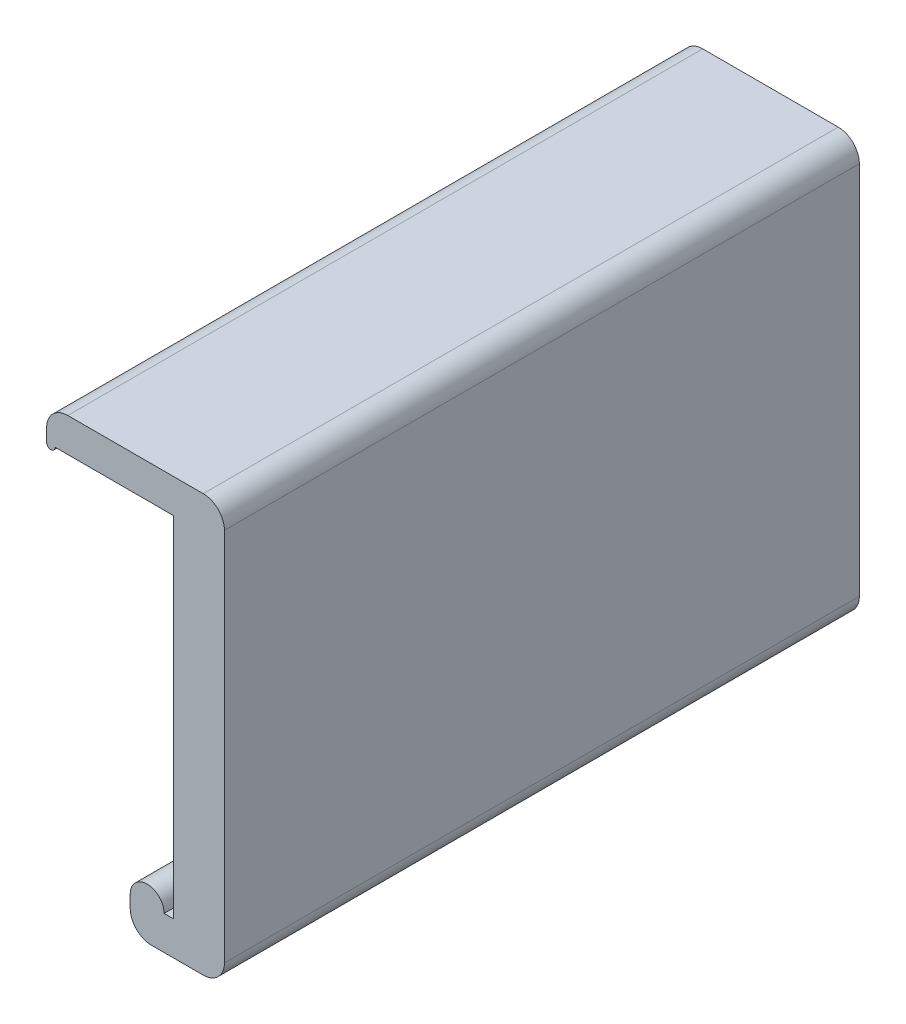
ISO-10303-21;
HEADER;
FILE_DESCRIPTION(('STEP AP214'),'2;1');
FILE_NAME('part.step','',(''),(''),'','','');
FILE_SCHEMA(('AUTOMOTIVE_DESIGN { 1 0 10303 214 1 1 1 1 }'));
ENDSEC;
DATA;
#1=APPLICATION_CONTEXT('core data for automotive mechanical design processes');
#2=APPLICATION_PROTOCOL_DEFINITION('international standard','automotive_design',2000,#1);
#3=PRODUCT_CONTEXT('',#1,'mechanical');
#4=PRODUCT('Part','Part','',(#3));
#5=PRODUCT_RELATED_PRODUCT_CATEGORY('part','',(#4));
#6=PRODUCT_DEFINITION_FORMATION('','',#4);
#7=PRODUCT_DEFINITION_CONTEXT('part definition',#1,'design');
#8=PRODUCT_DEFINITION('design','',#6,#7);
#9=PRODUCT_DEFINITION_SHAPE('','',#8);
#10=(LENGTH_UNIT() NAMED_UNIT(*) SI_UNIT(.MILLI.,.METRE.));
#11=(NAMED_UNIT(*) PLANE_ANGLE_UNIT() SI_UNIT($,.RADIAN.));
#12=(NAMED_UNIT(*) SI_UNIT($,.STERADIAN.) SOLID_ANGLE_UNIT());
#13=UNCERTAINTY_MEASURE_WITH_UNIT(LENGTH_MEASURE(1.E-05),#10,'distance_accuracy_value','');
#14=(GEOMETRIC_REPRESENTATION_CONTEXT(3) GLOBAL_UNCERTAINTY_ASSIGNED_CONTEXT((#13)) GLOBAL_UNIT_ASSIGNED_CONTEXT((#10,
#11,#12)) REPRESENTATION_CONTEXT('',''));
#15=CARTESIAN_POINT('',(0.,0.,0.));
#16=DIRECTION('',(0.,0.,1.));
#17=DIRECTION('',(1.,0.,0.));
#18=AXIS2_PLACEMENT_3D('',#15,#16,#17);
#19=CARTESIAN_POINT('',(0.,6.45,-7.5));
#20=DIRECTION('',(0.,-1.,0.));
#21=DIRECTION('',(0.,0.,-1.));
#22=AXIS2_PLACEMENT_3D('',#19,#20,#21);
#23=PLANE('',#22);
#24=DIRECTION('',(0.,0.,1.));
#25=VECTOR('',#24,1.);
#26=CARTESIAN_POINT('',(40.3413219588713,6.45,-7.5));
#27=LINE('',#26,#25);
#28=CARTESIAN_POINT('',(40.3413219588713,6.45,-7.5));
#29=VERTEX_POINT('',#28);
#30=CARTESIAN_POINT('',(40.3413219588713,6.45,7.5));
#31=VERTEX_POINT('',#30);
#32=EDGE_CURVE('E137',#29,#31,#27,.T.);
#33=ORIENTED_EDGE('',*,*,#32,.T.);
#34=DIRECTION('',(1.,0.,0.));
#35=VECTOR('',#34,1.);
#36=CARTESIAN_POINT('',(0.,6.45,7.5));
#37=LINE('',#36,#35);
#38=CARTESIAN_POINT('',(37.5413219588713,6.45,7.5));
#39=VERTEX_POINT('',#38);
#40=EDGE_CURVE('E140',#39,#31,#37,.T.);
#41=ORIENTED_EDGE('',*,*,#40,.F.);
#42=DIRECTION('',(0.,0.,1.));
#43=VECTOR('',#42,1.);
#44=CARTESIAN_POINT('',(37.5413219588713,6.45,-7.5));
#45=LINE('',#44,#43);
#46=CARTESIAN_POINT('',(37.5413219588713,6.45,-7.5));
#47=VERTEX_POINT('',#46);
#48=EDGE_CURVE('E202',#47,#39,#45,.T.);
#49=ORIENTED_EDGE('',*,*,#48,.F.);
#50=DIRECTION('',(1.,0.,0.));
#51=VECTOR('',#50,1.);
#52=CARTESIAN_POINT('',(0.,6.45,-7.5));
#53=LINE('',#52,#51);
#54=EDGE_CURVE('E142',#47,#29,#53,.T.);
#55=ORIENTED_EDGE('',*,*,#54,.T.);
#56=EDGE_LOOP('',(#33,#41,#49,#55));
#57=FACE_BOUND('',#56,.T.);
#58=ADVANCED_FACE('F35',(#57),#23,.T.);
#59=CARTESIAN_POINT('',(37.4413219588713,6.45,-7.5));
#60=DIRECTION('',(0.,0.,1.));
#61=DIRECTION('',(1.,0.,0.));
#62=AXIS2_PLACEMENT_3D('',#59,#60,#61);
#63=CYLINDRICAL_SURFACE('',#62,0.100000000000003);
#64=ORIENTED_EDGE('',*,*,#48,.T.);
#65=CARTESIAN_POINT('',(37.4413219588713,6.45,7.5));
#66=DIRECTION('',(0.,0.,1.));
#67=DIRECTION('',(1.,0.,0.));
#68=AXIS2_PLACEMENT_3D('',#65,#66,#67);
#69=CIRCLE('',#68,0.100000000000003);
#70=CARTESIAN_POINT('',(37.3413219588713,6.45,7.5));
#71=VERTEX_POINT('',#70);
#72=EDGE_CURVE('E161',#71,#39,#69,.T.);
#73=ORIENTED_EDGE('',*,*,#72,.F.);
#74=DIRECTION('',(0.,0.,1.));
#75=VECTOR('',#74,1.);
#76=CARTESIAN_POINT('',(37.3413219588713,6.45,-7.5));
#77=LINE('',#76,#75);
#78=CARTESIAN_POINT('',(37.3413219588713,6.45,-7.5));
#79=VERTEX_POINT('',#78);
#80=EDGE_CURVE('E205',#79,#71,#77,.T.);
#81=ORIENTED_EDGE('',*,*,#80,.F.);
#82=CARTESIAN_POINT('',(37.4413219588713,6.45,-7.5));
#83=DIRECTION('',(0.,0.,1.));
#84=DIRECTION('',(1.,0.,0.));
#85=AXIS2_PLACEMENT_3D('',#82,#83,#84);
#86=CIRCLE('',#85,0.100000000000003);
#87=EDGE_CURVE('E147',#79,#47,#86,.T.);
#88=ORIENTED_EDGE('',*,*,#87,.T.);
#89=EDGE_LOOP('',(#64,#73,#81,#88));
#90=FACE_BOUND('',#89,.T.);
#91=ADVANCED_FACE('F283',(#90),#63,.T.);
#92=CARTESIAN_POINT('',(37.3413219588713,0.,-7.5));
#93=DIRECTION('',(-1.,0.,0.));
#94=DIRECTION('',(0.,0.,1.));
#95=AXIS2_PLACEMENT_3D('',#92,#93,#94);
#96=PLANE('',#95);
#97=DIRECTION('',(0.,-1.,0.));
#98=VECTOR('',#97,1.);
#99=CARTESIAN_POINT('',(37.3413219588713,0.,7.5));
#100=LINE('',#99,#98);
#101=CARTESIAN_POINT('',(37.3413219588713,6.75,7.5));
#102=VERTEX_POINT('',#101);
#103=EDGE_CURVE('E177',#102,#71,#100,.T.);
#104=ORIENTED_EDGE('',*,*,#103,.F.);
#105=DIRECTION('',(0.,0.,1.));
#106=VECTOR('',#105,1.);
#107=CARTESIAN_POINT('',(37.3413219588713,6.75,-7.5));
#108=LINE('',#107,#106);
#109=CARTESIAN_POINT('',(37.3413219588713,6.75,-7.5));
#110=VERTEX_POINT('',#109);
#111=EDGE_CURVE('E226',#102,#110,#108,.F.);
#112=ORIENTED_EDGE('',*,*,#111,.T.);
#113=DIRECTION('',(0.,-1.,0.));
#114=VECTOR('',#113,1.);
#115=CARTESIAN_POINT('',(37.3413219588713,0.,-7.5));
#116=LINE('',#115,#114);
#117=EDGE_CURVE('E198',#110,#79,#116,.T.);
#118=ORIENTED_EDGE('',*,*,#117,.T.);
#119=ORIENTED_EDGE('',*,*,#80,.T.);
#120=EDGE_LOOP('',(#104,#112,#118,#119));
#121=FACE_BOUND('',#120,.T.);
#122=ADVANCED_FACE('F288',(#121),#96,.T.);
#123=CARTESIAN_POINT('',(0.,7.25,-7.5));
#124=DIRECTION('',(0.,1.,0.));
#125=DIRECTION('',(0.,0.,1.));
#126=AXIS2_PLACEMENT_3D('',#123,#124,#125);
#127=PLANE('',#126);
#128=DIRECTION('',(-1.,0.,0.));
#129=VECTOR('',#128,1.);
#130=CARTESIAN_POINT('',(0.,7.25,-7.5));
#131=LINE('',#130,#129);
#132=CARTESIAN_POINT('',(41.0413219588713,7.25,-7.5));
#133=VERTEX_POINT('',#132);
#134=CARTESIAN_POINT('',(37.8413219588713,7.25,-7.5));
#135=VERTEX_POINT('',#134);
#136=EDGE_CURVE('E195',#133,#135,#131,.T.);
#137=ORIENTED_EDGE('',*,*,#136,.T.);
#138=DIRECTION('',(0.,0.,1.));
#139=VECTOR('',#138,1.);
#140=CARTESIAN_POINT('',(37.8413219588713,7.25,-7.5));
#141=LINE('',#140,#139);
#142=CARTESIAN_POINT('',(37.8413219588713,7.25,7.5));
#143=VERTEX_POINT('',#142);
#144=EDGE_CURVE('E215',#135,#143,#141,.T.);
#145=ORIENTED_EDGE('',*,*,#144,.T.);
#146=DIRECTION('',(-1.,0.,0.));
#147=VECTOR('',#146,1.);
#148=CARTESIAN_POINT('',(0.,7.25,7.5));
#149=LINE('',#148,#147);
#150=CARTESIAN_POINT('',(41.0413219588713,7.25,7.5));
#151=VERTEX_POINT('',#150);
#152=EDGE_CURVE('E175',#151,#143,#149,.T.);
#153=ORIENTED_EDGE('',*,*,#152,.F.);
#154=DIRECTION('',(0.,0.,1.));
#155=VECTOR('',#154,1.);
#156=CARTESIAN_POINT('',(41.0413219588713,7.25,-7.5));
#157=LINE('',#156,#155);
#158=EDGE_CURVE('E204',#151,#133,#157,.F.);
#159=ORIENTED_EDGE('',*,*,#158,.T.);
#160=EDGE_LOOP('',(#137,#145,#153,#159));
#161=FACE_BOUND('',#160,.T.);
#162=ADVANCED_FACE('F308',(#161),#127,.T.);
#163=CARTESIAN_POINT('',(41.5413219588713,0.,-7.5));
#164=DIRECTION('',(1.,0.,0.));
#165=DIRECTION('',(0.,1.,0.));
#166=AXIS2_PLACEMENT_3D('',#163,#164,#165);
#167=PLANE('',#166);
#168=DIRECTION('',(0.,1.,0.));
#169=VECTOR('',#168,1.);
#170=CARTESIAN_POINT('',(41.5413219588713,0.,7.5));
#171=LINE('',#170,#169);
#172=CARTESIAN_POINT('',(41.5413219588713,-2.1,7.5));
#173=VERTEX_POINT('',#172);
#174=CARTESIAN_POINT('',(41.5413219588713,6.75,7.5));
#175=VERTEX_POINT('',#174);
#176=EDGE_CURVE('E172',#173,#175,#171,.T.);
#177=ORIENTED_EDGE('',*,*,#176,.F.);
#178=DIRECTION('',(0.,0.,1.));
#179=VECTOR('',#178,1.);
#180=CARTESIAN_POINT('',(41.5413219588713,-2.1,-7.5));
#181=LINE('',#180,#179);
#182=CARTESIAN_POINT('',(41.5413219588713,-2.1,-7.5));
#183=VERTEX_POINT('',#182);
#184=EDGE_CURVE('E11',#173,#183,#181,.F.);
#185=ORIENTED_EDGE('',*,*,#184,.T.);
#186=DIRECTION('',(0.,1.,0.));
#187=VECTOR('',#186,1.);
#188=CARTESIAN_POINT('',(41.5413219588713,0.,-7.5));
#189=LINE('',#188,#187);
#190=CARTESIAN_POINT('',(41.5413219588713,6.75,-7.5));
#191=VERTEX_POINT('',#190);
#192=EDGE_CURVE('E192',#183,#191,#189,.T.);
#193=ORIENTED_EDGE('',*,*,#192,.T.);
#194=DIRECTION('',(0.,0.,1.));
#195=VECTOR('',#194,1.);
#196=CARTESIAN_POINT('',(41.5413219588713,6.75,-7.5));
#197=LINE('',#196,#195);
#198=EDGE_CURVE('E43',#191,#175,#197,.T.);
#199=ORIENTED_EDGE('',*,*,#198,.T.);
#200=EDGE_LOOP('',(#177,#185,#193,#199));
#201=FACE_BOUND('',#200,.T.);
#202=ADVANCED_FACE('F245',(#201),#167,.T.);
#203=CARTESIAN_POINT('',(0.,-2.6,-7.5));
#204=DIRECTION('',(0.,1.,0.));
#205=DIRECTION('',(0.,0.,1.));
#206=AXIS2_PLACEMENT_3D('',#203,#204,#205);
#207=PLANE('',#206);
#208=DIRECTION('',(-1.,0.,0.));
#209=VECTOR('',#208,1.);
#210=CARTESIAN_POINT('',(0.,-2.6,7.5));
#211=LINE('',#210,#209);
#212=CARTESIAN_POINT('',(41.0413219588713,-2.6,7.5));
#213=VERTEX_POINT('',#212);
#214=CARTESIAN_POINT('',(39.8163219588713,-2.6,7.5));
#215=VERTEX_POINT('',#214);
#216=EDGE_CURVE('E170',#213,#215,#211,.T.);
#217=ORIENTED_EDGE('',*,*,#216,.T.);
#218=DIRECTION('',(0.,0.,1.));
#219=VECTOR('',#218,1.);
#220=CARTESIAN_POINT('',(39.8163219588713,-2.6,-7.5));
#221=LINE('',#220,#219);
#222=CARTESIAN_POINT('',(39.8163219588713,-2.6,-7.5));
#223=VERTEX_POINT('',#222);
#224=EDGE_CURVE('E58',#215,#223,#221,.F.);
#225=ORIENTED_EDGE('',*,*,#224,.T.);
#226=DIRECTION('',(-1.,0.,0.));
#227=VECTOR('',#226,1.);
#228=CARTESIAN_POINT('',(0.,-2.6,-7.5));
#229=LINE('',#228,#227);
#230=CARTESIAN_POINT('',(41.0413219588713,-2.6,-7.5));
#231=VERTEX_POINT('',#230);
#232=EDGE_CURVE('E190',#231,#223,#229,.T.);
#233=ORIENTED_EDGE('',*,*,#232,.F.);
#234=DIRECTION('',(0.,0.,1.));
#235=VECTOR('',#234,1.);
#236=CARTESIAN_POINT('',(41.0413219588713,-2.6,7.5));
#237=LINE('',#236,#235);
#238=EDGE_CURVE('E238',#231,#213,#237,.T.);
#239=ORIENTED_EDGE('',*,*,#238,.T.);
#240=EDGE_LOOP('',(#217,#225,#233,#239));
#241=FACE_BOUND('',#240,.T.);
#242=ADVANCED_FACE('F256',(#241),#207,.F.);
#243=CARTESIAN_POINT('',(39.3163219588713,3.41014733455579E-13,-7.5));
#244=DIRECTION('',(1.,0.,0.));
#245=DIRECTION('',(0.,1.,0.));
#246=AXIS2_PLACEMENT_3D('',#243,#244,#245);
#247=PLANE('',#246);
#248=DIRECTION('',(0.,1.,0.));
#249=VECTOR('',#248,1.);
#250=CARTESIAN_POINT('',(39.3163219588713,3.41014733455579E-13,-7.5));
#251=LINE('',#250,#249);
#252=CARTESIAN_POINT('',(39.3163219588713,-2.1,-7.5));
#253=VERTEX_POINT('',#252);
#254=CARTESIAN_POINT('',(39.3163219588713,-1.79999999999999,-7.5));
#255=VERTEX_POINT('',#254);
#256=EDGE_CURVE('E188',#253,#255,#251,.T.);
#257=ORIENTED_EDGE('',*,*,#256,.F.);
#258=DIRECTION('',(0.,0.,1.));
#259=VECTOR('',#258,1.);
#260=CARTESIAN_POINT('',(39.3163219588713,-2.1,-7.5));
#261=LINE('',#260,#259);
#262=CARTESIAN_POINT('',(39.3163219588713,-2.1,7.5));
#263=VERTEX_POINT('',#262);
#264=EDGE_CURVE('E235',#253,#263,#261,.T.);
#265=ORIENTED_EDGE('',*,*,#264,.T.);
#266=DIRECTION('',(0.,1.,0.));
#267=VECTOR('',#266,1.);
#268=CARTESIAN_POINT('',(39.3163219588713,3.41014733455579E-13,7.5));
#269=LINE('',#268,#267);
#270=CARTESIAN_POINT('',(39.3163219588713,-1.79999999999999,7.5));
#271=VERTEX_POINT('',#270);
#272=EDGE_CURVE('E168',#263,#271,#269,.T.);
#273=ORIENTED_EDGE('',*,*,#272,.T.);
#274=DIRECTION('',(0.,0.,1.));
#275=VECTOR('',#274,1.);
#276=CARTESIAN_POINT('',(39.3163219588713,-1.79999999999999,-7.5));
#277=LINE('',#276,#275);
#278=EDGE_CURVE('E208',#255,#271,#277,.T.);
#279=ORIENTED_EDGE('',*,*,#278,.F.);
#280=EDGE_LOOP('',(#257,#265,#273,#279));
#281=FACE_BOUND('',#280,.T.);
#282=ADVANCED_FACE('F264',(#281),#247,.F.);
#283=CARTESIAN_POINT('',(39.7163219588713,-1.79999999999999,-7.5));
#284=DIRECTION('',(0.,0.,1.));
#285=DIRECTION('',(1.,0.,0.));
#286=AXIS2_PLACEMENT_3D('',#283,#284,#285);
#287=CYLINDRICAL_SURFACE('',#286,0.399999999999998);
#288=ORIENTED_EDGE('',*,*,#278,.T.);
#289=CARTESIAN_POINT('',(39.7163219588713,-1.79999999999999,7.5));
#290=DIRECTION('',(0.,0.,1.));
#291=DIRECTION('',(1.,0.,0.));
#292=AXIS2_PLACEMENT_3D('',#289,#290,#291);
#293=CIRCLE('',#292,0.399999999999998);
#294=CARTESIAN_POINT('',(40.1163219588713,-1.79999999999999,7.5));
#295=VERTEX_POINT('',#294);
#296=EDGE_CURVE('E165',#271,#295,#293,.F.);
#297=ORIENTED_EDGE('',*,*,#296,.T.);
#298=DIRECTION('',(0.,0.,1.));
#299=VECTOR('',#298,1.);
#300=CARTESIAN_POINT('',(40.1163219588713,-1.79999999999999,-7.5));
#301=LINE('',#300,#299);
#302=CARTESIAN_POINT('',(40.1163219588713,-1.79999999999999,-7.5));
#303=VERTEX_POINT('',#302);
#304=EDGE_CURVE('E211',#303,#295,#301,.T.);
#305=ORIENTED_EDGE('',*,*,#304,.F.);
#306=CARTESIAN_POINT('',(39.7163219588713,-1.79999999999999,-7.5));
#307=DIRECTION('',(0.,0.,1.));
#308=DIRECTION('',(1.,0.,0.));
#309=AXIS2_PLACEMENT_3D('',#306,#307,#308);
#310=CIRCLE('',#309,0.399999999999998);
#311=EDGE_CURVE('E186',#255,#303,#310,.F.);
#312=ORIENTED_EDGE('',*,*,#311,.F.);
#313=EDGE_LOOP('',(#288,#297,#305,#312));
#314=FACE_BOUND('',#313,.T.);
#315=ADVANCED_FACE('F269',(#314),#287,.T.);
#316=CARTESIAN_POINT('',(0.,-1.79999999999996,-7.5));
#317=DIRECTION('',(0.,1.,0.));
#318=DIRECTION('',(-1.,0.,0.));
#319=AXIS2_PLACEMENT_3D('',#316,#317,#318);
#320=PLANE('',#319);
#321=ORIENTED_EDGE('',*,*,#304,.T.);
#322=DIRECTION('',(-1.,0.,0.));
#323=VECTOR('',#322,1.);
#324=CARTESIAN_POINT('',(0.,-1.79999999999996,7.5));
#325=LINE('',#324,#323);
#326=CARTESIAN_POINT('',(40.3413219588713,-1.79999999999999,7.5));
#327=VERTEX_POINT('',#326);
#328=EDGE_CURVE('E155',#327,#295,#325,.T.);
#329=ORIENTED_EDGE('',*,*,#328,.F.);
#330=DIRECTION('',(0.,0.,1.));
#331=VECTOR('',#330,1.);
#332=CARTESIAN_POINT('',(40.3413219588713,-1.79999999999999,-7.5));
#333=LINE('',#332,#331);
#334=CARTESIAN_POINT('',(40.3413219588713,-1.79999999999999,-7.5));
#335=VERTEX_POINT('',#334);
#336=EDGE_CURVE('E146',#335,#327,#333,.T.);
#337=ORIENTED_EDGE('',*,*,#336,.F.);
#338=DIRECTION('',(-1.,0.,0.));
#339=VECTOR('',#338,1.);
#340=CARTESIAN_POINT('',(0.,-1.79999999999996,-7.5));
#341=LINE('',#340,#339);
#342=EDGE_CURVE('E183',#335,#303,#341,.T.);
#343=ORIENTED_EDGE('',*,*,#342,.T.);
#344=EDGE_LOOP('',(#321,#329,#337,#343));
#345=FACE_BOUND('',#344,.T.);
#346=ADVANCED_FACE('F273',(#345),#320,.T.);
#347=CARTESIAN_POINT('',(40.3413219588713,0.,-7.5));
#348=DIRECTION('',(-1.,0.,0.));
#349=DIRECTION('',(0.,0.,1.));
#350=AXIS2_PLACEMENT_3D('',#347,#348,#349);
#351=PLANE('',#350);
#352=ORIENTED_EDGE('',*,*,#336,.T.);
#353=DIRECTION('',(0.,-1.,0.));
#354=VECTOR('',#353,1.);
#355=CARTESIAN_POINT('',(40.3413219588713,0.,7.5));
#356=LINE('',#355,#354);
#357=EDGE_CURVE('E150',#31,#327,#356,.T.);
#358=ORIENTED_EDGE('',*,*,#357,.F.);
#359=ORIENTED_EDGE('',*,*,#32,.F.);
#360=DIRECTION('',(0.,-1.,0.));
#361=VECTOR('',#360,1.);
#362=CARTESIAN_POINT('',(40.3413219588713,0.,-7.5));
#363=LINE('',#362,#361);
#364=EDGE_CURVE('E181',#29,#335,#363,.T.);
#365=ORIENTED_EDGE('',*,*,#364,.T.);
#366=EDGE_LOOP('',(#352,#358,#359,#365));
#367=FACE_BOUND('',#366,.T.);
#368=ADVANCED_FACE('F151',(#367),#351,.T.);
#369=CARTESIAN_POINT('',(0.,0.,-7.5));
#370=DIRECTION('',(0.,0.,1.));
#371=DIRECTION('',(1.,0.,0.));
#372=AXIS2_PLACEMENT_3D('',#369,#370,#371);
#373=PLANE('',#372);
#374=ORIENTED_EDGE('',*,*,#117,.F.);
#375=CARTESIAN_POINT('',(37.8413219588713,6.75,-7.5));
#376=DIRECTION('',(0.,0.,1.));
#377=DIRECTION('',(1.,0.,0.));
#378=AXIS2_PLACEMENT_3D('',#375,#376,#377);
#379=CIRCLE('',#378,0.5);
#380=EDGE_CURVE('E233',#110,#135,#379,.F.);
#381=ORIENTED_EDGE('',*,*,#380,.T.);
#382=ORIENTED_EDGE('',*,*,#136,.F.);
#383=CARTESIAN_POINT('',(41.0413219588713,6.75,-7.5));
#384=DIRECTION('',(0.,0.,1.));
#385=DIRECTION('',(1.,0.,0.));
#386=AXIS2_PLACEMENT_3D('',#383,#384,#385);
#387=CIRCLE('',#386,0.5);
#388=EDGE_CURVE('E228',#133,#191,#387,.F.);
#389=ORIENTED_EDGE('',*,*,#388,.T.);
#390=ORIENTED_EDGE('',*,*,#192,.F.);
#391=CARTESIAN_POINT('',(41.0413219588713,-2.1,-7.5));
#392=DIRECTION('',(0.,0.,1.));
#393=DIRECTION('',(1.,0.,0.));
#394=AXIS2_PLACEMENT_3D('',#391,#392,#393);
#395=CIRCLE('',#394,0.5);
#396=EDGE_CURVE('E230',#183,#231,#395,.F.);
#397=ORIENTED_EDGE('',*,*,#396,.T.);
#398=ORIENTED_EDGE('',*,*,#232,.T.);
#399=CARTESIAN_POINT('',(39.8163219588713,-2.1,-7.5));
#400=DIRECTION('',(0.,0.,1.));
#401=DIRECTION('',(1.,0.,0.));
#402=AXIS2_PLACEMENT_3D('',#399,#400,#401);
#403=CIRCLE('',#402,0.5);
#404=EDGE_CURVE('E50',#223,#253,#403,.F.);
#405=ORIENTED_EDGE('',*,*,#404,.T.);
#406=ORIENTED_EDGE('',*,*,#256,.T.);
#407=ORIENTED_EDGE('',*,*,#311,.T.);
#408=ORIENTED_EDGE('',*,*,#342,.F.);
#409=ORIENTED_EDGE('',*,*,#364,.F.);
#410=ORIENTED_EDGE('',*,*,#54,.F.);
#411=ORIENTED_EDGE('',*,*,#87,.F.);
#412=EDGE_LOOP('',(#374,#381,#382,#389,#390,#397,#398,#405,#406,#407,#408,#409,#410,#411));
#413=FACE_BOUND('',#412,.T.);
#414=ADVANCED_FACE('F258',(#413),#373,.F.);
#415=CARTESIAN_POINT('',(0.,0.,7.5));
#416=DIRECTION('',(0.,0.,1.));
#417=DIRECTION('',(1.,0.,0.));
#418=AXIS2_PLACEMENT_3D('',#415,#416,#417);
#419=PLANE('',#418);
#420=ORIENTED_EDGE('',*,*,#152,.T.);
#421=CARTESIAN_POINT('',(37.8413219588713,6.75,7.5));
#422=DIRECTION('',(0.,0.,1.));
#423=DIRECTION('',(1.,0.,0.));
#424=AXIS2_PLACEMENT_3D('',#421,#422,#423);
#425=CIRCLE('',#424,0.5);
#426=EDGE_CURVE('E224',#143,#102,#425,.T.);
#427=ORIENTED_EDGE('',*,*,#426,.T.);
#428=ORIENTED_EDGE('',*,*,#103,.T.);
#429=ORIENTED_EDGE('',*,*,#72,.T.);
#430=ORIENTED_EDGE('',*,*,#40,.T.);
#431=ORIENTED_EDGE('',*,*,#357,.T.);
#432=ORIENTED_EDGE('',*,*,#328,.T.);
#433=ORIENTED_EDGE('',*,*,#296,.F.);
#434=ORIENTED_EDGE('',*,*,#272,.F.);
#435=CARTESIAN_POINT('',(39.8163219588713,-2.1,7.5));
#436=DIRECTION('',(0.,0.,1.));
#437=DIRECTION('',(1.,0.,0.));
#438=AXIS2_PLACEMENT_3D('',#435,#436,#437);
#439=CIRCLE('',#438,0.5);
#440=EDGE_CURVE('E222',#263,#215,#439,.T.);
#441=ORIENTED_EDGE('',*,*,#440,.T.);
#442=ORIENTED_EDGE('',*,*,#216,.F.);
#443=CARTESIAN_POINT('',(41.0413219588713,-2.1,7.5));
#444=DIRECTION('',(0.,0.,1.));
#445=DIRECTION('',(1.,0.,0.));
#446=AXIS2_PLACEMENT_3D('',#443,#444,#445);
#447=CIRCLE('',#446,0.5);
#448=EDGE_CURVE('E220',#213,#173,#447,.T.);
#449=ORIENTED_EDGE('',*,*,#448,.T.);
#450=ORIENTED_EDGE('',*,*,#176,.T.);
#451=CARTESIAN_POINT('',(41.0413219588713,6.75,7.5));
#452=DIRECTION('',(0.,0.,1.));
#453=DIRECTION('',(1.,0.,0.));
#454=AXIS2_PLACEMENT_3D('',#451,#452,#453);
#455=CIRCLE('',#454,0.5);
#456=EDGE_CURVE('E218',#175,#151,#455,.T.);
#457=ORIENTED_EDGE('',*,*,#456,.T.);
#458=EDGE_LOOP('',(#420,#427,#428,#429,#430,#431,#432,#433,#434,#441,#442,#449,#450,#457));
#459=FACE_BOUND('',#458,.T.);
#460=ADVANCED_FACE('F159',(#459),#419,.T.);
#461=CARTESIAN_POINT('',(37.8413219588713,6.75,-7.5));
#462=DIRECTION('',(0.,0.,1.));
#463=DIRECTION('',(1.,0.,0.));
#464=AXIS2_PLACEMENT_3D('',#461,#462,#463);
#465=CYLINDRICAL_SURFACE('',#464,0.5);
#466=ORIENTED_EDGE('',*,*,#380,.F.);
#467=ORIENTED_EDGE('',*,*,#111,.F.);
#468=ORIENTED_EDGE('',*,*,#426,.F.);
#469=ORIENTED_EDGE('',*,*,#144,.F.);
#470=EDGE_LOOP('',(#466,#467,#468,#469));
#471=FACE_BOUND('',#470,.T.);
#472=ADVANCED_FACE('F292',(#471),#465,.T.);
#473=CARTESIAN_POINT('',(39.8163219588713,-2.1,-7.5));
#474=DIRECTION('',(0.,0.,1.));
#475=DIRECTION('',(1.,0.,0.));
#476=AXIS2_PLACEMENT_3D('',#473,#474,#475);
#477=CYLINDRICAL_SURFACE('',#476,0.5);
#478=ORIENTED_EDGE('',*,*,#404,.F.);
#479=ORIENTED_EDGE('',*,*,#224,.F.);
#480=ORIENTED_EDGE('',*,*,#440,.F.);
#481=ORIENTED_EDGE('',*,*,#264,.F.);
#482=EDGE_LOOP('',(#478,#479,#480,#481));
#483=FACE_BOUND('',#482,.T.);
#484=ADVANCED_FACE('F261',(#483),#477,.T.);
#485=CARTESIAN_POINT('',(41.0413219588713,-2.1,-7.5));
#486=DIRECTION('',(0.,0.,-1.));
#487=DIRECTION('',(-1.,0.,0.));
#488=AXIS2_PLACEMENT_3D('',#485,#486,#487);
#489=CYLINDRICAL_SURFACE('',#488,0.5);
#490=ORIENTED_EDGE('',*,*,#396,.F.);
#491=ORIENTED_EDGE('',*,*,#184,.F.);
#492=ORIENTED_EDGE('',*,*,#448,.F.);
#493=ORIENTED_EDGE('',*,*,#238,.F.);
#494=EDGE_LOOP('',(#490,#491,#492,#493));
#495=FACE_BOUND('',#494,.T.);
#496=ADVANCED_FACE('F255',(#495),#489,.T.);
#497=CARTESIAN_POINT('',(41.0413219588713,6.75,-7.5));
#498=DIRECTION('',(0.,0.,1.));
#499=DIRECTION('',(1.,0.,0.));
#500=AXIS2_PLACEMENT_3D('',#497,#498,#499);
#501=CYLINDRICAL_SURFACE('',#500,0.5);
#502=ORIENTED_EDGE('',*,*,#388,.F.);
#503=ORIENTED_EDGE('',*,*,#158,.F.);
#504=ORIENTED_EDGE('',*,*,#456,.F.);
#505=ORIENTED_EDGE('',*,*,#198,.F.);
#506=EDGE_LOOP('',(#502,#503,#504,#505));
#507=FACE_BOUND('',#506,.T.);
#508=ADVANCED_FACE('F37',(#507),#501,.T.);
#509=CLOSED_SHELL('',(#58,#91,#122,#162,#202,#242,#282,#315,#346,#368,#414,#460,#472,#484,#496,#508));
#510=MANIFOLD_SOLID_BREP('B2',#509);
#511=ADVANCED_BREP_SHAPE_REPRESENTATION('',(#18,#510),#14);
#512=SHAPE_DEFINITION_REPRESENTATION(#9,#511);
ENDSEC;
END-ISO-10303-21;
